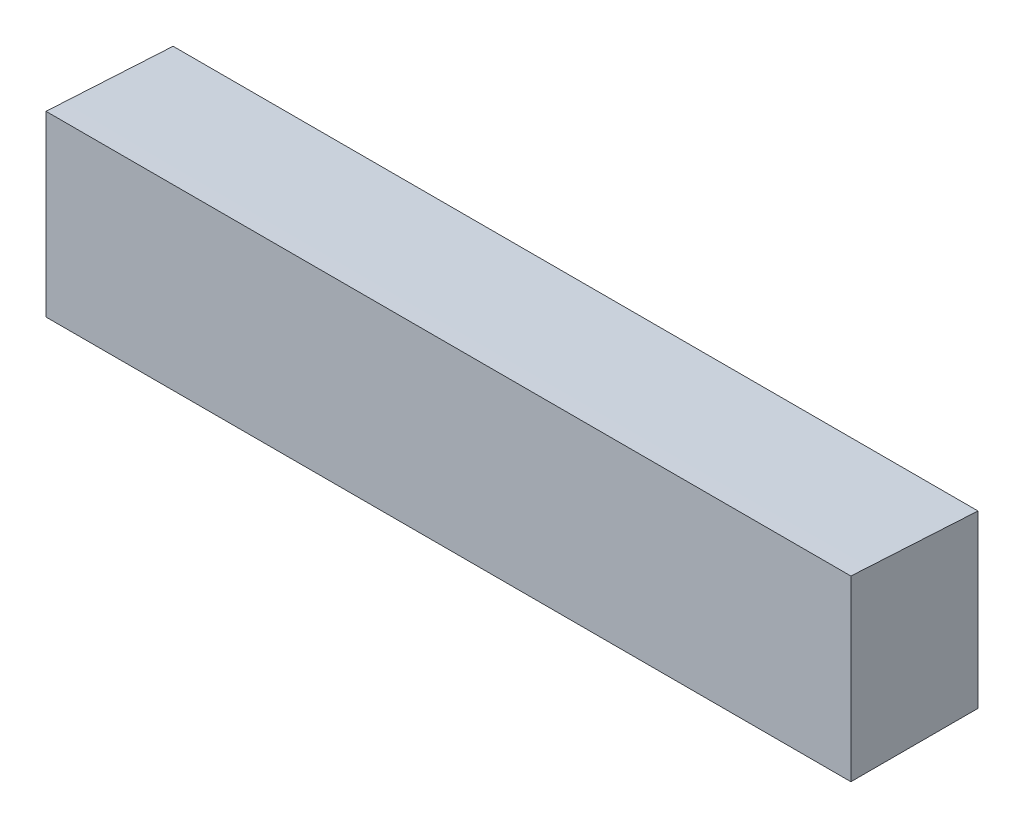
ISO-10303-21;
HEADER;
FILE_DESCRIPTION(('STEP AP214'),'2;1');
FILE_NAME('part.step','',(''),(''),'','','');
FILE_SCHEMA(('AUTOMOTIVE_DESIGN { 1 0 10303 214 1 1 1 1 }'));
ENDSEC;
DATA;
#1=APPLICATION_CONTEXT('core data for automotive mechanical design processes');
#2=APPLICATION_PROTOCOL_DEFINITION('international standard','automotive_design',2000,#1);
#3=PRODUCT_CONTEXT('',#1,'mechanical');
#4=PRODUCT('Part','Part','',(#3));
#5=PRODUCT_RELATED_PRODUCT_CATEGORY('part','',(#4));
#6=PRODUCT_DEFINITION_FORMATION('','',#4);
#7=PRODUCT_DEFINITION_CONTEXT('part definition',#1,'design');
#8=PRODUCT_DEFINITION('design','',#6,#7);
#9=PRODUCT_DEFINITION_SHAPE('','',#8);
#10=(LENGTH_UNIT() NAMED_UNIT(*) SI_UNIT(.MILLI.,.METRE.));
#11=(NAMED_UNIT(*) PLANE_ANGLE_UNIT() SI_UNIT($,.RADIAN.));
#12=(NAMED_UNIT(*) SI_UNIT($,.STERADIAN.) SOLID_ANGLE_UNIT());
#13=UNCERTAINTY_MEASURE_WITH_UNIT(LENGTH_MEASURE(1.E-05),#10,'distance_accuracy_value','');
#14=(GEOMETRIC_REPRESENTATION_CONTEXT(3) GLOBAL_UNCERTAINTY_ASSIGNED_CONTEXT((#13)) GLOBAL_UNIT_ASSIGNED_CONTEXT((#10,
#11,#12)) REPRESENTATION_CONTEXT('',''));
#15=CARTESIAN_POINT('',(0.,0.,0.));
#16=DIRECTION('',(0.,0.,1.));
#17=DIRECTION('',(1.,0.,0.));
#18=AXIS2_PLACEMENT_3D('',#15,#16,#17);
#19=CARTESIAN_POINT('',(-200.,-196.883488142695,0.));
#20=CARTESIAN_POINT('',(-200.,-189.069163208415,-93.0446551492894));
#21=CARTESIAN_POINT('',(-200.,-207.243937597042,-302.610093537368));
#22=CARTESIAN_POINT('',(-200.,-209.075197803941,-413.146581257138));
#23=CARTESIAN_POINT('',(-200.,-149.907972883575,-472.384774493397));
#24=CARTESIAN_POINT('',(-200.,-57.0358984147016,-361.760258551688));
#25=CARTESIAN_POINT('',(-200.,250.000000000014,-480.000000000005));
#26=B_SPLINE_CURVE_WITH_KNOTS('',3,(#19,#20,#21,#22,#23,#24,#25),.UNSPECIFIED.,.F.,.F.,(4,1,1,1,
4),(0.,0.361871867439847,0.526261734758969,0.755385014590914,1.),.UNSPECIFIED.);
#27=DIRECTION('',(1.,0.,0.));
#28=VECTOR('',#27,1.);
#29=SURFACE_OF_LINEAR_EXTRUSION('',#26,#28);
#30=OFFSET_SURFACE('',#29,10.,.F.);
#31=DIRECTION('',(1.,0.,0.));
#32=VECTOR('',#31,1.);
#33=CARTESIAN_POINT('',(1.40163697879751E-13,-207.94155422762,-185.));
#34=LINE('',#33,#32);
#35=CARTESIAN_POINT('',(-190.,-207.94155422762,-185.));
#36=VERTEX_POINT('',#35);
#37=CARTESIAN_POINT('',(0.,-207.94155422762,-185.));
#38=VERTEX_POINT('',#37);
#39=EDGE_CURVE('E49',#36,#38,#34,.T.);
#40=ORIENTED_EDGE('',*,*,#39,.T.);
#41=CARTESIAN_POINT('',(0.,-207.94155422762,-185.));
#42=CARTESIAN_POINT('',(0.,-208.030221493509,-186.66698833353));
#43=CARTESIAN_POINT('',(0.,-208.119961056577,-188.333919475189));
#44=CARTESIAN_POINT('',(0.,-208.301468671501,-191.667667231826));
#45=CARTESIAN_POINT('',(0.,-208.39323671837,-193.334483847075));
#46=CARTESIAN_POINT('',(0.,-208.578685533963,-196.668008834215));
#47=CARTESIAN_POINT('',(0.,-208.67236630066,-198.334717206219));
#48=CARTESIAN_POINT('',(0.,-208.861525405957,-201.668031576063));
#49=CARTESIAN_POINT('',(0.,-208.957003744198,-203.334637573925));
#50=CARTESIAN_POINT('',(0.,-209.149642853349,-206.667754382513));
#51=CARTESIAN_POINT('',(0.,-209.246803626375,-208.334265193117));
#52=CARTESIAN_POINT('',(0.,-209.442691531051,-211.667198464908));
#53=CARTESIAN_POINT('',(0.,-209.54141866616,-213.333620925891));
#54=CARTESIAN_POINT('',(0.,-209.640870788859,-215.));
#55=B_SPLINE_CURVE_WITH_KNOTS('',3,(#41,#42,#43,#44,#45,#46,#47,#48,#49,#50,#51,#52,#53,#54),
.UNSPECIFIED.,.F.,.F.,(4,2,2,2,2,2,4),(0.,5.00803376144956,10.0160552167868,15.0240713653454,
20.0320865166279,25.0401079719719,30.0481404860258),.UNSPECIFIED.);
#56=CARTESIAN_POINT('',(0.,-209.640870788859,-215.));
#57=VERTEX_POINT('',#56);
#58=EDGE_CURVE('E105',#38,#57,#55,.T.);
#59=ORIENTED_EDGE('',*,*,#58,.T.);
#60=DIRECTION('',(1.,0.,0.));
#61=VECTOR('',#60,1.);
#62=CARTESIAN_POINT('',(1.40163191894989E-13,-209.640870788859,-215.));
#63=LINE('',#62,#61);
#64=CARTESIAN_POINT('',(-190.,-209.640870788859,-215.));
#65=VERTEX_POINT('',#64);
#66=EDGE_CURVE('E92',#57,#65,#63,.F.);
#67=ORIENTED_EDGE('',*,*,#66,.T.);
#68=CARTESIAN_POINT('',(-190.,-206.848406491872,-0.83690040879665));
#69=CARTESIAN_POINT('',(-190.,-206.680899729474,-2.83196435834714));
#70=CARTESIAN_POINT('',(-190.,-206.524739920902,-4.82794940591907));
#71=CARTESIAN_POINT('',(-190.,-206.229758714729,-8.86783995350959));
#72=CARTESIAN_POINT('',(-190.,-206.091424591732,-10.9117811192717));
#73=CARTESIAN_POINT('',(-190.,-205.697632628618,-17.1755782071918));
#74=CARTESIAN_POINT('',(-190.,-205.474098659275,-21.3974546028109));
#75=CARTESIAN_POINT('',(-190.,-205.089308396329,-30.0026610464738));
#76=CARTESIAN_POINT('',(-190.,-204.930703285704,-34.3861057928549));
#77=CARTESIAN_POINT('',(-190.,-204.6723096484,-43.2949730817195));
#78=CARTESIAN_POINT('',(-190.,-204.574563993186,-47.8204536207943));
#79=CARTESIAN_POINT('',(-190.,-204.434143727457,-56.9941016438361));
#80=CARTESIAN_POINT('',(-190.,-204.393022699433,-61.642291834893));
#81=CARTESIAN_POINT('',(-190.,-204.361933921012,-71.0422741164044));
#82=CARTESIAN_POINT('',(-190.,-204.373125088734,-75.7940694243542));
#83=CARTESIAN_POINT('',(-190.,-204.442589942356,-85.3823239687476));
#84=CARTESIAN_POINT('',(-190.,-204.501702491738,-90.2187767666326));
#85=CARTESIAN_POINT('',(-190.,-204.662884106211,-99.9575193365573));
#86=CARTESIAN_POINT('',(-190.,-204.765533117713,-104.859799210251));
#87=CARTESIAN_POINT('',(-190.,-205.132650540976,-119.690886641539));
#88=CARTESIAN_POINT('',(-190.,-205.455107634532,-129.618269005237));
#89=CARTESIAN_POINT('',(-190.,-206.218795525464,-149.512537428811));
#90=CARTESIAN_POINT('',(-190.,-206.660548671311,-159.479402612641));
#91=CARTESIAN_POINT('',(-190.,-208.097850487291,-188.913348352305));
#92=CARTESIAN_POINT('',(-190.,-209.219720056613,-208.374164334439));
#93=CARTESIAN_POINT('',(-190.,-210.987613690559,-237.032066844139));
#94=CARTESIAN_POINT('',(-190.,-211.572827259253,-246.233228047827));
#95=CARTESIAN_POINT('',(-190.,-212.446836672774,-259.83862152767));
#96=CARTESIAN_POINT('',(-190.,-212.731126535985,-264.243125985354));
#97=CARTESIAN_POINT('',(-190.,-213.289060704734,-272.89722728791));
#98=CARTESIAN_POINT('',(-190.,-213.562727683203,-277.146822766935));
#99=CARTESIAN_POINT('',(-190.,-214.094769678484,-285.473164528526));
#100=CARTESIAN_POINT('',(-190.,-214.353313492666,-289.549899950289));
#101=CARTESIAN_POINT('',(-190.,-214.850441949062,-297.512733151689));
#102=CARTESIAN_POINT('',(-190.,-215.089394053153,-301.398807839575));
#103=CARTESIAN_POINT('',(-190.,-215.542421833008,-308.962767304756));
#104=CARTESIAN_POINT('',(-190.,-215.757144261278,-312.640613127198));
#105=CARTESIAN_POINT('',(-190.,-216.15767842579,-319.776181037423));
#106=CARTESIAN_POINT('',(-190.,-216.344452112103,-323.233848357707));
#107=CARTESIAN_POINT('',(-190.,-216.680486192346,-329.94153700421));
#108=CARTESIAN_POINT('',(-190.,-216.831331669813,-333.191476727294));
#109=CARTESIAN_POINT('',(-190.,-217.08595049588,-339.501988729252));
#110=CARTESIAN_POINT('',(-190.,-217.191969029704,-342.562466677417));
#111=CARTESIAN_POINT('',(-190.,-217.347340099764,-348.512402677128));
#112=CARTESIAN_POINT('',(-190.,-217.399548898466,-351.401780564259));
#113=CARTESIAN_POINT('',(-190.,-217.437258729537,-357.027840327293));
#114=CARTESIAN_POINT('',(-190.,-217.426151453857,-359.764491705852));
#115=CARTESIAN_POINT('',(-190.,-217.326743144481,-365.103122161024));
#116=CARTESIAN_POINT('',(-190.,-217.242231928415,-367.705162309784));
#117=CARTESIAN_POINT('',(-190.,-216.985030043556,-372.791926850525));
#118=CARTESIAN_POINT('',(-190.,-216.816325976363,-375.276841157314));
#119=CARTESIAN_POINT('',(-190.,-216.379390283407,-380.145421228546));
#120=CARTESIAN_POINT('',(-190.,-216.115075381989,-382.529428942616));
#121=CARTESIAN_POINT('',(-190.,-215.475380674847,-387.210742385725));
#122=CARTESIAN_POINT('',(-190.,-215.10354081459,-389.508516706862));
#123=CARTESIAN_POINT('',(-190.,-214.451082268095,-392.916253057906));
#124=CARTESIAN_POINT('',(-190.,-214.22027787381,-394.035865543185));
#125=CARTESIAN_POINT('',(-190.,-213.727353254093,-396.257772541768));
#126=CARTESIAN_POINT('',(-190.,-213.465529843328,-397.360132513627));
#127=CARTESIAN_POINT('',(-190.,-212.90934490599,-399.54865971033));
#128=CARTESIAN_POINT('',(-190.,-212.615216296005,-400.634886057611));
#129=CARTESIAN_POINT('',(-190.,-211.993369004565,-402.792168712012));
#130=CARTESIAN_POINT('',(-190.,-211.665814678645,-403.863272321521));
#131=CARTESIAN_POINT('',(-190.,-210.976442480095,-405.989846060897));
#132=CARTESIAN_POINT('',(-190.,-210.614761658881,-407.045360559698));
#133=CARTESIAN_POINT('',(-190.,-209.856642441995,-409.138797964619));
#134=CARTESIAN_POINT('',(-190.,-209.460357720043,-410.176776437627));
#135=CARTESIAN_POINT('',(-190.,-208.632475578434,-412.233096192294));
#136=CARTESIAN_POINT('',(-190.,-208.201046867728,-413.251505290433));
#137=CARTESIAN_POINT('',(-190.,-207.302225358477,-415.26658709377));
#138=CARTESIAN_POINT('',(-190.,-206.835012169975,-416.263339781266));
#139=CARTESIAN_POINT('',(-190.,-205.863874471296,-418.232937355987));
#140=CARTESIAN_POINT('',(-190.,-205.360135251458,-419.205873445784));
#141=CARTESIAN_POINT('',(-190.,-204.315100840248,-421.125568827787));
#142=CARTESIAN_POINT('',(-190.,-203.773990221215,-422.072428416929));
#143=CARTESIAN_POINT('',(-190.,-202.653275615583,-423.937573643505));
#144=CARTESIAN_POINT('',(-190.,-202.073847862406,-424.855964975864));
#145=CARTESIAN_POINT('',(-190.,-200.875484241904,-426.661608932179));
#146=CARTESIAN_POINT('',(-190.,-200.256707496636,-427.54896696487));
#147=CARTESIAN_POINT('',(-190.,-198.978571054947,-429.289776188998));
#148=CARTESIAN_POINT('',(-190.,-198.319343745931,-430.143324369179));
#149=CARTESIAN_POINT('',(-190.,-196.959242416487,-431.813468642932));
#150=CARTESIAN_POINT('',(-190.,-196.258463971665,-432.630142467503));
#151=CARTESIAN_POINT('',(-190.,-194.814158435088,-434.223270603683));
#152=CARTESIAN_POINT('',(-190.,-194.070680652332,-434.999769414184));
#153=CARTESIAN_POINT('',(-190.,-192.922978736205,-436.131368298507));
#154=CARTESIAN_POINT('',(-190.,-192.534991545494,-436.503048026284));
#155=CARTESIAN_POINT('',(-190.,-191.748028320033,-437.234936695569));
#156=CARTESIAN_POINT('',(-190.,-191.349047934296,-437.595140969973));
#157=CARTESIAN_POINT('',(-190.,-190.540035743604,-438.303546317665));
#158=CARTESIAN_POINT('',(-190.,-190.129995802685,-438.651738099706));
#159=CARTESIAN_POINT('',(-190.,-189.298809005686,-439.335581710445));
#160=CARTESIAN_POINT('',(-190.,-188.877650180739,-439.671219000767));
#161=CARTESIAN_POINT('',(-190.,-188.024201965795,-440.329390655713));
#162=CARTESIAN_POINT('',(-190.,-187.591896816373,-440.651904594766));
#163=CARTESIAN_POINT('',(-190.,-186.716163149998,-441.283248585974));
#164=CARTESIAN_POINT('',(-190.,-186.272715203689,-441.592051701354));
#165=CARTESIAN_POINT('',(-190.,-185.374739783985,-442.195376338106));
#166=CARTESIAN_POINT('',(-190.,-184.920189421378,-442.489863807975));
#167=CARTESIAN_POINT('',(-190.,-184.000093261762,-443.06394697904));
#168=CARTESIAN_POINT('',(-190.,-183.534521413077,-443.343500946001));
#169=CARTESIAN_POINT('',(-190.,-182.592510176358,-443.887099114829));
#170=CARTESIAN_POINT('',(-190.,-182.116041957033,-444.151093376444));
#171=CARTESIAN_POINT('',(-190.,-181.152412298376,-444.662951998329));
#172=CARTESIAN_POINT('',(-190.,-180.66521971025,-444.9107577418));
#173=CARTESIAN_POINT('',(-190.,-179.680363681935,-445.389623467796));
#174=CARTESIAN_POINT('',(-190.,-179.182667308238,-445.620615743395));
#175=CARTESIAN_POINT('',(-190.,-178.1770744751,-446.065249984083));
#176=CARTESIAN_POINT('',(-190.,-177.669143889956,-446.278814795585));
#177=CARTESIAN_POINT('',(-190.,-176.643400721545,-446.688008256435));
#178=CARTESIAN_POINT('',(-190.,-176.125553460959,-446.883550002813));
#179=CARTESIAN_POINT('',(-190.,-175.080339714544,-447.256137635738));
#180=CARTESIAN_POINT('',(-190.,-174.552938676629,-447.433086614169));
#181=CARTESIAN_POINT('',(-190.,-173.489020609486,-447.767962350359));
#182=CARTESIAN_POINT('',(-190.,-172.952469856015,-447.925781977363));
#183=CARTESIAN_POINT('',(-190.,-171.870690297951,-448.221912542186));
#184=CARTESIAN_POINT('',(-190.,-171.325429316785,-448.360105938194));
#185=CARTESIAN_POINT('',(-190.,-170.226694818797,-448.616543048131));
#186=CARTESIAN_POINT('',(-190.,-169.673191403955,-448.734658641859));
#187=CARTESIAN_POINT('',(-190.,-168.558456891737,-448.950548929727));
#188=CARTESIAN_POINT('',(-190.,-167.997198913117,-449.048184774707));
#189=CARTESIAN_POINT('',(-190.,-166.867450436745,-449.222776904159));
#190=CARTESIAN_POINT('',(-190.,-166.298936817892,-449.299583476186));
#191=CARTESIAN_POINT('',(-190.,-165.15517313261,-449.432232060989));
#192=CARTESIAN_POINT('',(-190.,-164.579904452414,-449.487913385525));
#193=CARTESIAN_POINT('',(-190.,-163.423118256496,-449.578079523875));
#194=CARTESIAN_POINT('',(-190.,-162.841587383374,-449.612392593291));
#195=CARTESIAN_POINT('',(-190.,-161.672747034352,-449.659641039567));
#196=CARTESIAN_POINT('',(-190.,-161.085430204629,-449.672393582274));
#197=CARTESIAN_POINT('',(-190.,-159.905462717753,-449.676386779282));
#198=CARTESIAN_POINT('',(-190.,-159.312811449488,-449.667433540854));
#199=CARTESIAN_POINT('',(-190.,-158.12258744824,-449.627922920725));
#200=CARTESIAN_POINT('',(-190.,-157.525021568557,-449.597160701174));
#201=CARTESIAN_POINT('',(-190.,-156.325342709072,-449.513975793326));
#202=CARTESIAN_POINT('',(-190.,-155.723244738952,-449.461337534733));
#203=CARTESIAN_POINT('',(-190.,-154.514833979895,-449.334373520626));
#204=CARTESIAN_POINT('',(-190.,-153.908545004899,-449.259821786912));
#205=CARTESIAN_POINT('',(-190.,-152.692039800474,-449.089026124344));
#206=CARTESIAN_POINT('',(-190.,-152.081856776564,-448.992546252874));
#207=CARTESIAN_POINT('',(-190.,-150.8578054187,-448.777905145958));
#208=CARTESIAN_POINT('',(-190.,-150.243980195928,-448.659498569156));
#209=CARTESIAN_POINT('',(-190.,-149.012840208221,-448.401023340597));
#210=CARTESIAN_POINT('',(-190.,-148.395578874953,-448.260700624457));
#211=CARTESIAN_POINT('',(-190.,-147.157720613185,-447.958416440662));
#212=CARTESIAN_POINT('',(-190.,-146.537187788355,-447.79619298806));
#213=CARTESIAN_POINT('',(-190.,-145.292889740189,-447.450122815611));
#214=CARTESIAN_POINT('',(-190.,-144.66919938239,-447.266006994332));
#215=CARTESIAN_POINT('',(-190.,-143.418684676956,-446.876179550672));
#216=CARTESIAN_POINT('',(-190.,-142.791946540861,-446.670192931452));
#217=CARTESIAN_POINT('',(-190.,-140.892346262428,-446.014719904194));
#218=CARTESIAN_POINT('',(-190.,-139.629453409923,-445.535931557919));
#219=CARTESIAN_POINT('',(-190.,-137.741313424412,-444.760299070792));
#220=CARTESIAN_POINT('',(-190.,-137.10551687113,-444.488625011567));
#221=CARTESIAN_POINT('',(-190.,-135.833351376189,-443.924472958441));
#222=CARTESIAN_POINT('',(-190.,-135.197081257116,-443.631771452008));
#223=CARTESIAN_POINT('',(-190.,-133.298901367262,-442.73124799881));
#224=CARTESIAN_POINT('',(-190.,-132.047668052924,-442.101026333054));
#225=CARTESIAN_POINT('',(-190.,-129.552683711011,-440.801507030489));
#226=CARTESIAN_POINT('',(-190.,-128.309083330141,-440.131926115796));
#227=CARTESIAN_POINT('',(-190.,-125.804092380674,-438.766551743186));
#228=CARTESIAN_POINT('',(-190.,-124.542842713502,-438.070501853988));
#229=CARTESIAN_POINT('',(-190.,-121.979068012845,-436.662411301967));
#230=CARTESIAN_POINT('',(-190.,-120.676455350504,-435.950528930046));
#231=CARTESIAN_POINT('',(-190.,-118.007940751132,-434.519482982449));
#232=CARTESIAN_POINT('',(-190.,-116.641584694367,-433.801158978827));
#233=CARTESIAN_POINT('',(-190.,-113.824553568488,-432.365398036719));
#234=CARTESIAN_POINT('',(-190.,-112.37299542901,-431.649682630415));
#235=CARTESIAN_POINT('',(-190.,-109.365055109549,-430.227305486088));
#236=CARTESIAN_POINT('',(-190.,-107.80736113623,-429.523404899872));
#237=CARTESIAN_POINT('',(-190.,-104.566867203116,-428.13321298125));
#238=CARTESIAN_POINT('',(-190.,-102.882380116109,-427.450842785472));
#239=CARTESIAN_POINT('',(-190.,-99.3681048852072,-426.112929051726));
#240=CARTESIAN_POINT('',(-190.,-97.5363514885188,-425.462541431636));
#241=CARTESIAN_POINT('',(-190.,-93.7074380834072,-424.198655158072));
#242=CARTESIAN_POINT('',(-190.,-91.7081635955179,-423.591566099555));
#243=CARTESIAN_POINT('',(-190.,-87.5242836403396,-422.425272867135));
#244=CARTESIAN_POINT('',(-190.,-85.3375591934523,-421.873689488976));
#245=CARTESIAN_POINT('',(-190.,-80.759162994672,-420.830333917941));
#246=CARTESIAN_POINT('',(-190.,-78.3655109169214,-420.347293232865));
#247=CARTESIAN_POINT('',(-190.,-73.3540675458149,-419.45379857025));
#248=CARTESIAN_POINT('',(-190.,-70.7345607102679,-419.053040029475));
#249=CARTESIAN_POINT('',(-190.,-65.2527174076372,-418.337600696241));
#250=CARTESIAN_POINT('',(-190.,-62.3890286614597,-418.033403029719));
#251=CARTESIAN_POINT('',(-190.,-56.4006601271487,-417.525134746128));
#252=CARTESIAN_POINT('',(-190.,-53.2750574571998,-417.332147050876));
#253=CARTESIAN_POINT('',(-190.,-46.7452110076733,-417.060750636511));
#254=CARTESIAN_POINT('',(-190.,-43.3405081344027,-416.993840498795));
#255=CARTESIAN_POINT('',(-190.,-36.2352722261545,-416.989316741283));
#256=CARTESIAN_POINT('',(-190.,-32.5347507811429,-417.063448192556));
#257=CARTESIAN_POINT('',(-190.,-24.8210812188987,-417.355880608669));
#258=CARTESIAN_POINT('',(-190.,-20.8084008284193,-417.586025608156));
#259=CARTESIAN_POINT('',(-190.,-12.4539353232368,-418.205431541476));
#260=CARTESIAN_POINT('',(-190.,-8.11304444931169,-418.606512370698));
#261=CARTESIAN_POINT('',(-190.,0.914072479054318,-419.582752922996));
#262=CARTESIAN_POINT('',(-190.,5.59901674519767,-420.16960964894));
#263=CARTESIAN_POINT('',(-190.,15.3302858776806,-421.532344863796));
#264=CARTESIAN_POINT('',(-190.,20.374985070204,-422.319721188753));
#265=CARTESIAN_POINT('',(-190.,30.8416765826227,-424.098396854754));
#266=CARTESIAN_POINT('',(-190.,36.2617442324815,-425.10093826696));
#267=CARTESIAN_POINT('',(-190.,47.4949938936284,-427.324792779908));
#268=CARTESIAN_POINT('',(-190.,53.305995959769,-428.557052145574));
#269=CARTESIAN_POINT('',(-190.,65.3368764501111,-431.255134650196));
#270=CARTESIAN_POINT('',(-190.,71.5543606912027,-432.731581713853));
#271=CARTESIAN_POINT('',(-190.,84.4139321931524,-435.932775414948));
#272=CARTESIAN_POINT('',(-190.,91.0534485309205,-437.667807844087));
#273=CARTESIAN_POINT('',(-190.,104.772793202531,-441.400854544702));
#274=CARTESIAN_POINT('',(-190.,111.849907478954,-443.408809031086));
#275=CARTESIAN_POINT('',(-190.,126.460150741597,-447.702332640811));
#276=CARTESIAN_POINT('',(-190.,133.990452114216,-449.997495314386));
#277=CARTESIAN_POINT('',(-190.,149.522778311725,-454.880022904477));
#278=CARTESIAN_POINT('',(-190.,157.52188800284,-457.47663832987));
#279=CARTESIAN_POINT('',(-190.,174.00753552938,-462.976619182039));
#280=CARTESIAN_POINT('',(-190.,182.491092129731,-465.888899182761));
#281=CARTESIAN_POINT('',(-190.,199.961402316681,-472.034717940555));
#282=CARTESIAN_POINT('',(-190.,208.945131087831,-475.27684461888));
#283=CARTESIAN_POINT('',(-190.,222.596366897664,-480.313104389418));
#284=CARTESIAN_POINT('',(-190.,227.280956388311,-482.061143348394));
#285=CARTESIAN_POINT('',(-190.,236.781446361964,-485.644035332574));
#286=CARTESIAN_POINT('',(-190.,241.596963136514,-487.479906069613));
#287=CARTESIAN_POINT('',(-190.,246.40626416593,-489.331937781346));
#288=B_SPLINE_CURVE_WITH_KNOTS('',3,(#68,#69,#70,#71,#72,#73,#74,#75,#76,#77,#78,#79,#80,#81,
#82,#83,#84,#85,#86,#87,#88,#89,#90,#91,#92,#93,#94,#95,#96,#97,#98,#99,#100,#101,#102,#103,
#104,#105,#106,#107,#108,#109,#110,#111,#112,#113,#114,#115,#116,#117,#118,#119,#120,#121,#122,
#123,#124,#125,#126,#127,#128,#129,#130,#131,#132,#133,#134,#135,#136,#137,#138,#139,#140,#141,
#142,#143,#144,#145,#146,#147,#148,#149,#150,#151,#152,#153,#154,#155,#156,#157,#158,#159,#160,
#161,#162,#163,#164,#165,#166,#167,#168,#169,#170,#171,#172,#173,#174,#175,#176,#177,#178,#179,
#180,#181,#182,#183,#184,#185,#186,#187,#188,#189,#190,#191,#192,#193,#194,#195,#196,#197,#198,
#199,#200,#201,#202,#203,#204,#205,#206,#207,#208,#209,#210,#211,#212,#213,#214,#215,#216,#217,
#218,#219,#220,#221,#222,#223,#224,#225,#226,#227,#228,#229,#230,#231,#232,#233,#234,#235,#236,
#237,#238,#239,#240,#241,#242,#243,#244,#245,#246,#247,#248,#249,#250,#251,#252,#253,#254,#255,
#256,#257,#258,#259,#260,#261,#262,#263,#264,#265,#266,#267,#268,#269,#270,#271,#272,#273,#274,
#275,#276,#277,#278,#279,#280,#281,#282,#283,#284,#285,#286,#287),.UNSPECIFIED.,.F.,.F.,(4,2,2,
2,2,2,2,2,2,2,2,2,2,2,2,2,2,2,2,2,2,2,2,2,2,2,2,2,2,2,2,2,2,2,2,2,2,2,2,2,2,2,2,2,2,2,2,2,2,2,2,
2,2,2,2,2,2,2,2,2,2,2,2,2,2,2,2,2,2,2,2,2,2,2,2,2,2,2,2,2,2,2,2,2,2,2,2,2,2,2,2,2,2,2,2,2,2,2,2,
2,2,2,2,2,2,2,2,2,2,4),(0.,6.00616812600453,12.1519167653748,24.8345222374942,37.9929541272527,
51.5721370337467,65.5169244394189,79.7720886970808,94.282320285502,108.992232666119,
138.789048351388,168.718508955115,227.195851528579,254.855190715289,268.096192984184,
280.871388903668,293.126161567196,304.806391939028,315.858695695924,326.246766550717,
336.006938425829,345.193583714362,353.862607447494,362.071771175223,369.880714596479,
377.350714603268,384.544107957686,391.523394076183,394.952429498747,398.35096376079,
401.726430294479,405.086033537666,408.432676593063,411.765147626857,415.082470295225,
418.384114652931,421.670046511134,424.940773098537,428.197381993567,431.441569484882,
434.675653713514,437.902567637347,441.125827272641,442.73750237018,444.34982478331,
445.963367519931,447.578724311101,449.196505969038,450.817336785296,452.441851130001,
454.070690478257,455.704501090139,457.343932550967,458.989637373116,460.642271861979,
462.302498303801,463.97098854936,465.648428919524,467.335526287346,469.033015109669,
470.741665040038,472.462288800648,474.195749832423,475.942969343951,477.704932378877,
479.482692523672,481.277375107128,483.090178663222,484.922374680145,486.77530567946,
488.650381750403,490.549075795852,492.47291767327,494.423487599741,496.402408979031,
500.451552220075,502.525589652717,504.626434975609,508.828274963022,513.065337891659,
517.38704453429,521.84031943342,526.470989139896,531.325512254823,536.452414008207,
541.903176406507,547.732562765125,553.998480330165,560.761539408908,568.084471238669,
576.031536089217,584.668006150884,594.059761368659,604.273001343258,615.374056279244,
627.429272549894,640.504949205914,654.667306445451,669.982472554585,686.516480613653,
704.335269836516,723.504688749373,744.090498863615,766.158378276374,789.773925040991,
815.002660321971,841.910031397885,870.561414585462,885.561619349176,901.022309016377),.UNSPECIFIED.);
#289=EDGE_CURVE('E118',#65,#36,#288,.F.);
#290=ORIENTED_EDGE('',*,*,#289,.T.);
#291=EDGE_LOOP('',(#40,#59,#67,#290));
#292=FACE_BOUND('',#291,.T.);
#293=ADVANCED_FACE('F39',(#292),#30,.F.);
#294=CARTESIAN_POINT('',(-190.,250.002,-185.));
#295=DIRECTION('',(0.,0.,1.));
#296=DIRECTION('',(1.,0.,0.));
#297=AXIS2_PLACEMENT_3D('',#294,#295,#296);
#298=PLANE('',#297);
#299=DIRECTION('',(0.,-1.,0.));
#300=VECTOR('',#299,1.);
#301=CARTESIAN_POINT('',(0.,250.002,-185.));
#302=LINE('',#301,#300);
#303=CARTESIAN_POINT('',(0.,-250.,-185.));
#304=VERTEX_POINT('',#303);
#305=EDGE_CURVE('E55',#38,#304,#302,.T.);
#306=ORIENTED_EDGE('',*,*,#305,.F.);
#307=ORIENTED_EDGE('',*,*,#39,.F.);
#308=DIRECTION('',(0.,-1.,0.));
#309=VECTOR('',#308,1.);
#310=CARTESIAN_POINT('',(-190.,250.002,-185.));
#311=LINE('',#310,#309);
#312=CARTESIAN_POINT('',(-190.,-250.,-185.));
#313=VERTEX_POINT('',#312);
#314=EDGE_CURVE('E103',#36,#313,#311,.T.);
#315=ORIENTED_EDGE('',*,*,#314,.T.);
#316=DIRECTION('',(-1.,0.,0.));
#317=VECTOR('',#316,1.);
#318=CARTESIAN_POINT('',(-190.,-250.,-185.));
#319=LINE('',#318,#317);
#320=EDGE_CURVE('E99',#304,#313,#319,.T.);
#321=ORIENTED_EDGE('',*,*,#320,.F.);
#322=EDGE_LOOP('',(#306,#307,#315,#321));
#323=FACE_BOUND('',#322,.T.);
#324=ADVANCED_FACE('F136',(#323),#298,.T.);
#325=CARTESIAN_POINT('',(-190.,250.002,-215.));
#326=DIRECTION('',(0.,0.,-1.));
#327=DIRECTION('',(-1.,0.,0.));
#328=AXIS2_PLACEMENT_3D('',#325,#326,#327);
#329=PLANE('',#328);
#330=DIRECTION('',(0.,1.,0.));
#331=VECTOR('',#330,1.);
#332=CARTESIAN_POINT('',(0.,-250.,-215.));
#333=LINE('',#332,#331);
#334=CARTESIAN_POINT('',(0.,-250.,-215.));
#335=VERTEX_POINT('',#334);
#336=EDGE_CURVE('E80',#335,#57,#333,.T.);
#337=ORIENTED_EDGE('',*,*,#336,.F.);
#338=DIRECTION('',(1.,0.,0.));
#339=VECTOR('',#338,1.);
#340=CARTESIAN_POINT('',(-190.,-250.,-215.));
#341=LINE('',#340,#339);
#342=CARTESIAN_POINT('',(-190.,-250.,-215.));
#343=VERTEX_POINT('',#342);
#344=EDGE_CURVE('E90',#343,#335,#341,.T.);
#345=ORIENTED_EDGE('',*,*,#344,.F.);
#346=DIRECTION('',(0.,-1.,0.));
#347=VECTOR('',#346,1.);
#348=CARTESIAN_POINT('',(-190.,250.002,-215.));
#349=LINE('',#348,#347);
#350=EDGE_CURVE('E115',#65,#343,#349,.T.);
#351=ORIENTED_EDGE('',*,*,#350,.F.);
#352=ORIENTED_EDGE('',*,*,#66,.F.);
#353=EDGE_LOOP('',(#337,#345,#351,#352));
#354=FACE_BOUND('',#353,.T.);
#355=ADVANCED_FACE('F88',(#354),#329,.T.);
#356=CARTESIAN_POINT('',(0.,-250.,0.));
#357=DIRECTION('',(0.,-1.,0.));
#358=DIRECTION('',(0.,0.,-1.));
#359=AXIS2_PLACEMENT_3D('',#356,#357,#358);
#360=PLANE('',#359);
#361=DIRECTION('',(0.,0.,-1.));
#362=VECTOR('',#361,1.);
#363=CARTESIAN_POINT('',(0.,-250.,0.));
#364=LINE('',#363,#362);
#365=EDGE_CURVE('E11',#304,#335,#364,.T.);
#366=ORIENTED_EDGE('',*,*,#365,.F.);
#367=ORIENTED_EDGE('',*,*,#320,.T.);
#368=DIRECTION('',(0.,0.,-1.));
#369=VECTOR('',#368,1.);
#370=CARTESIAN_POINT('',(-190.,-250.,-185.));
#371=LINE('',#370,#369);
#372=EDGE_CURVE('E97',#313,#343,#371,.T.);
#373=ORIENTED_EDGE('',*,*,#372,.T.);
#374=ORIENTED_EDGE('',*,*,#344,.T.);
#375=EDGE_LOOP('',(#366,#367,#373,#374));
#376=FACE_BOUND('',#375,.T.);
#377=ADVANCED_FACE('F95',(#376),#360,.T.);
#378=CARTESIAN_POINT('',(-190.,250.002,-185.));
#379=DIRECTION('',(-1.,0.,0.));
#380=DIRECTION('',(0.,0.,1.));
#381=AXIS2_PLACEMENT_3D('',#378,#379,#380);
#382=PLANE('',#381);
#383=ORIENTED_EDGE('',*,*,#289,.F.);
#384=ORIENTED_EDGE('',*,*,#350,.T.);
#385=ORIENTED_EDGE('',*,*,#372,.F.);
#386=ORIENTED_EDGE('',*,*,#314,.F.);
#387=EDGE_LOOP('',(#383,#384,#385,#386));
#388=FACE_BOUND('',#387,.T.);
#389=ADVANCED_FACE('F138',(#388),#382,.T.);
#390=CARTESIAN_POINT('',(0.,-250.,-173.298722835112));
#391=DIRECTION('',(-1.,0.,0.));
#392=DIRECTION('',(0.,0.,1.));
#393=AXIS2_PLACEMENT_3D('',#390,#391,#392);
#394=PLANE('',#393);
#395=ORIENTED_EDGE('',*,*,#305,.T.);
#396=ORIENTED_EDGE('',*,*,#365,.T.);
#397=ORIENTED_EDGE('',*,*,#336,.T.);
#398=ORIENTED_EDGE('',*,*,#58,.F.);
#399=EDGE_LOOP('',(#395,#396,#397,#398));
#400=FACE_BOUND('',#399,.T.);
#401=ADVANCED_FACE('F79',(#400),#394,.F.);
#402=CLOSED_SHELL('',(#293,#324,#355,#377,#389,#401));
#403=MANIFOLD_SOLID_BREP('B2',#402);
#404=ADVANCED_BREP_SHAPE_REPRESENTATION('',(#18,#403),#14);
#405=SHAPE_DEFINITION_REPRESENTATION(#9,#404);
ENDSEC;
END-ISO-10303-21;
